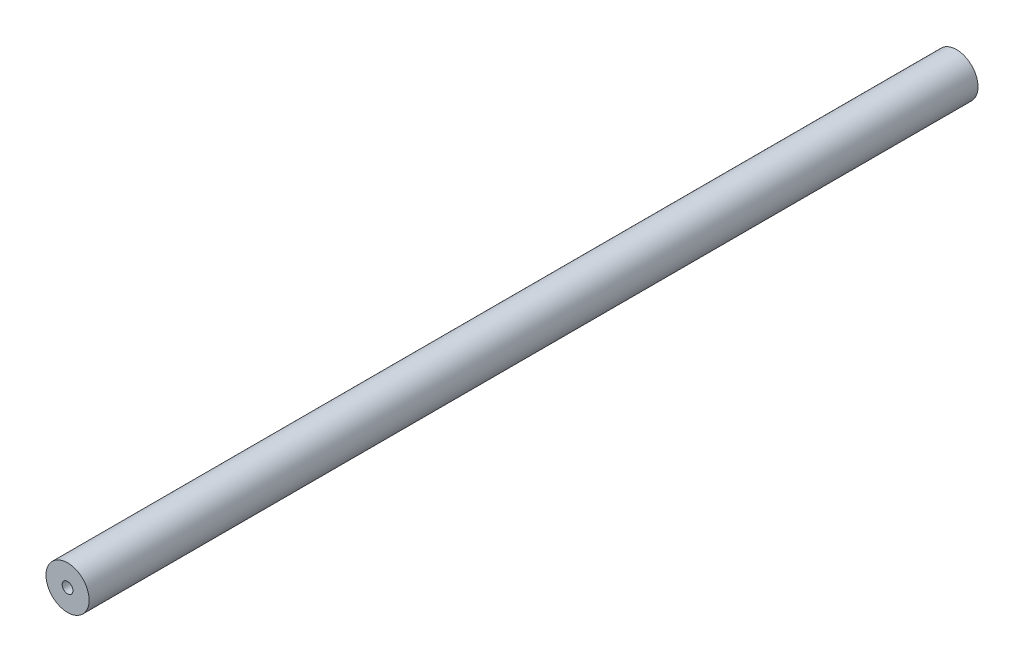
ISO-10303-21;
HEADER;
FILE_DESCRIPTION(('STEP AP214'),'2;1');
FILE_NAME('part.step','',(''),(''),'','','');
FILE_SCHEMA(('AUTOMOTIVE_DESIGN { 1 0 10303 214 1 1 1 1 }'));
ENDSEC;
DATA;
#1=APPLICATION_CONTEXT('core data for automotive mechanical design processes');
#2=APPLICATION_PROTOCOL_DEFINITION('international standard','automotive_design',2000,#1);
#3=PRODUCT_CONTEXT('',#1,'mechanical');
#4=PRODUCT('Part','Part','',(#3));
#5=PRODUCT_RELATED_PRODUCT_CATEGORY('part','',(#4));
#6=PRODUCT_DEFINITION_FORMATION('','',#4);
#7=PRODUCT_DEFINITION_CONTEXT('part definition',#1,'design');
#8=PRODUCT_DEFINITION('design','',#6,#7);
#9=PRODUCT_DEFINITION_SHAPE('','',#8);
#10=(LENGTH_UNIT() NAMED_UNIT(*) SI_UNIT(.MILLI.,.METRE.));
#11=(NAMED_UNIT(*) PLANE_ANGLE_UNIT() SI_UNIT($,.RADIAN.));
#12=(NAMED_UNIT(*) SI_UNIT($,.STERADIAN.) SOLID_ANGLE_UNIT());
#13=UNCERTAINTY_MEASURE_WITH_UNIT(LENGTH_MEASURE(1.E-05),#10,'distance_accuracy_value','');
#14=(GEOMETRIC_REPRESENTATION_CONTEXT(3) GLOBAL_UNCERTAINTY_ASSIGNED_CONTEXT((#13)) GLOBAL_UNIT_ASSIGNED_CONTEXT((#10,
#11,#12)) REPRESENTATION_CONTEXT('',''));
#15=CARTESIAN_POINT('',(0.,0.,0.));
#16=DIRECTION('',(0.,0.,1.));
#17=DIRECTION('',(1.,0.,0.));
#18=AXIS2_PLACEMENT_3D('',#15,#16,#17);
#19=CARTESIAN_POINT('',(0.,0.,330.));
#20=DIRECTION('',(0.,0.,-1.));
#21=DIRECTION('',(-1.,0.,0.));
#22=AXIS2_PLACEMENT_3D('',#19,#20,#21);
#23=CYLINDRICAL_SURFACE('',#22,8.);
#24=CARTESIAN_POINT('',(0.,0.,330.));
#25=DIRECTION('',(0.,0.,1.));
#26=DIRECTION('',(1.,0.,0.));
#27=AXIS2_PLACEMENT_3D('',#24,#25,#26);
#28=CIRCLE('',#27,8.);
#29=CARTESIAN_POINT('',(-8.,0.,330.));
#30=VERTEX_POINT('',#29);
#31=EDGE_CURVE('E10',#30,#30,#28,.T.);
#32=CARTESIAN_POINT('',(0.,0.,0.));
#33=DIRECTION('',(0.,0.,1.));
#34=DIRECTION('',(1.,0.,0.));
#35=AXIS2_PLACEMENT_3D('',#32,#33,#34);
#36=CIRCLE('',#35,8.);
#37=CARTESIAN_POINT('',(-8.,0.,0.));
#38=VERTEX_POINT('',#37);
#39=EDGE_CURVE('E40',#38,#38,#36,.T.);
#40=CARTESIAN_POINT('',(-8.,0.,330.));
#41=CARTESIAN_POINT('',(-8.,0.,326.5625));
#42=CARTESIAN_POINT('',(-8.,0.,323.125));
#43=CARTESIAN_POINT('',(-8.,0.,316.25));
#44=CARTESIAN_POINT('',(-8.,0.,312.8125));
#45=CARTESIAN_POINT('',(-8.,0.,305.9375));
#46=CARTESIAN_POINT('',(-8.,0.,302.5));
#47=CARTESIAN_POINT('',(-8.,0.,295.625));
#48=CARTESIAN_POINT('',(-8.,0.,292.1875));
#49=CARTESIAN_POINT('',(-8.,0.,285.3125));
#50=CARTESIAN_POINT('',(-8.,0.,281.875));
#51=CARTESIAN_POINT('',(-8.,0.,275.));
#52=CARTESIAN_POINT('',(-8.,0.,271.5625));
#53=CARTESIAN_POINT('',(-8.,0.,264.6875));
#54=CARTESIAN_POINT('',(-8.,0.,261.25));
#55=CARTESIAN_POINT('',(-8.,0.,254.375));
#56=CARTESIAN_POINT('',(-8.,0.,250.9375));
#57=CARTESIAN_POINT('',(-8.,0.,244.0625));
#58=CARTESIAN_POINT('',(-8.,0.,240.625));
#59=CARTESIAN_POINT('',(-8.,0.,233.75));
#60=CARTESIAN_POINT('',(-8.,0.,230.3125));
#61=CARTESIAN_POINT('',(-8.,0.,223.4375));
#62=CARTESIAN_POINT('',(-8.,0.,220.));
#63=CARTESIAN_POINT('',(-8.,0.,213.125));
#64=CARTESIAN_POINT('',(-8.,0.,209.6875));
#65=CARTESIAN_POINT('',(-8.,0.,202.8125));
#66=CARTESIAN_POINT('',(-8.,0.,199.375));
#67=CARTESIAN_POINT('',(-8.,0.,192.5));
#68=CARTESIAN_POINT('',(-8.,0.,189.0625));
#69=CARTESIAN_POINT('',(-8.,0.,182.1875));
#70=CARTESIAN_POINT('',(-8.,0.,178.75));
#71=CARTESIAN_POINT('',(-8.,0.,171.875));
#72=CARTESIAN_POINT('',(-8.,0.,168.4375));
#73=CARTESIAN_POINT('',(-8.,0.,161.5625));
#74=CARTESIAN_POINT('',(-8.,0.,158.125));
#75=CARTESIAN_POINT('',(-8.,0.,151.25));
#76=CARTESIAN_POINT('',(-8.,0.,147.8125));
#77=CARTESIAN_POINT('',(-8.,0.,140.9375));
#78=CARTESIAN_POINT('',(-8.,0.,137.5));
#79=CARTESIAN_POINT('',(-8.,0.,130.625));
#80=CARTESIAN_POINT('',(-8.,0.,127.1875));
#81=CARTESIAN_POINT('',(-8.,0.,120.3125));
#82=CARTESIAN_POINT('',(-8.,0.,116.875));
#83=CARTESIAN_POINT('',(-8.,0.,110.));
#84=CARTESIAN_POINT('',(-8.,0.,106.5625));
#85=CARTESIAN_POINT('',(-8.,0.,99.6875));
#86=CARTESIAN_POINT('',(-8.,0.,96.25));
#87=CARTESIAN_POINT('',(-8.,0.,89.375));
#88=CARTESIAN_POINT('',(-8.,0.,85.9375));
#89=CARTESIAN_POINT('',(-8.,0.,79.0625));
#90=CARTESIAN_POINT('',(-8.,0.,75.625));
#91=CARTESIAN_POINT('',(-8.,0.,68.75));
#92=CARTESIAN_POINT('',(-8.,0.,65.3125));
#93=CARTESIAN_POINT('',(-8.,0.,58.4375));
#94=CARTESIAN_POINT('',(-8.,0.,55.));
#95=CARTESIAN_POINT('',(-8.,0.,48.125));
#96=CARTESIAN_POINT('',(-8.,0.,44.6875));
#97=CARTESIAN_POINT('',(-8.,0.,37.8125));
#98=CARTESIAN_POINT('',(-8.,0.,34.375));
#99=CARTESIAN_POINT('',(-8.,0.,27.5));
#100=CARTESIAN_POINT('',(-8.,0.,24.0625));
#101=CARTESIAN_POINT('',(-8.,0.,17.1875));
#102=CARTESIAN_POINT('',(-8.,0.,13.75));
#103=CARTESIAN_POINT('',(-8.,0.,6.875));
#104=CARTESIAN_POINT('',(-8.,0.,3.4375));
#105=CARTESIAN_POINT('',(-8.,0.,0.));
#106=B_SPLINE_CURVE_WITH_KNOTS('',3,(#40,#41,#42,#43,#44,#45,#46,#47,#48,#49,#50,#51,#52,#53,
#54,#55,#56,#57,#58,#59,#60,#61,#62,#63,#64,#65,#66,#67,#68,#69,#70,#71,#72,#73,#74,#75,#76,#77,
#78,#79,#80,#81,#82,#83,#84,#85,#86,#87,#88,#89,#90,#91,#92,#93,#94,#95,#96,#97,#98,#99,#100,
#101,#102,#103,#104,#105),.UNSPECIFIED.,.F.,.F.,(4,2,2,2,2,2,2,2,2,2,2,2,2,2,2,2,2,2,2,2,2,2,2,
2,2,2,2,2,2,2,2,2,4),(0.,10.3125000000001,20.6250000000001,30.9375000000001,41.2500000000001,
51.5625000000001,61.8750000000001,72.1875000000001,82.5000000000001,92.8125000000001,103.125,
113.4375,123.75,134.0625,144.375,154.6875,165.,175.3125,185.625,195.9375,206.25,216.5625,
226.875,237.1875,247.5,257.8125,268.125,278.4375,288.75,299.0625,309.375,319.6875,330.),.UNSPECIFIED.);
#107=EDGE_CURVE('BSEAM37',#30,#38,#106,.T.);
#108=ORIENTED_EDGE('',*,*,#31,.F.);
#109=ORIENTED_EDGE('',*,*,#39,.T.);
#110=ORIENTED_EDGE('',*,*,#107,.T.);
#111=ORIENTED_EDGE('',*,*,#107,.F.);
#112=EDGE_LOOP('',(#108,#110,#109,#111));
#113=FACE_BOUND('',#112,.T.);
#114=ADVANCED_FACE('F37',(#113),#23,.T.);
#115=CARTESIAN_POINT('',(0.,0.,330.));
#116=DIRECTION('',(0.,0.,1.));
#117=DIRECTION('',(1.,0.,0.));
#118=AXIS2_PLACEMENT_3D('',#115,#116,#117);
#119=PLANE('',#118);
#120=CARTESIAN_POINT('',(0.,0.,330.));
#121=DIRECTION('',(0.,0.,1.));
#122=DIRECTION('',(1.,0.,0.));
#123=AXIS2_PLACEMENT_3D('',#120,#121,#122);
#124=CIRCLE('',#123,2.);
#125=CARTESIAN_POINT('',(2.,0.,330.));
#126=VERTEX_POINT('',#125);
#127=EDGE_CURVE('E51',#126,#126,#124,.T.);
#128=ORIENTED_EDGE('',*,*,#127,.F.);
#129=EDGE_LOOP('',(#128));
#130=FACE_BOUND('',#129,.T.);
#131=ORIENTED_EDGE('',*,*,#31,.T.);
#132=EDGE_LOOP('',(#131));
#133=FACE_BOUND('',#132,.T.);
#134=ADVANCED_FACE('F68',(#130,#133),#119,.T.);
#135=CARTESIAN_POINT('',(0.,0.,0.));
#136=DIRECTION('',(0.,0.,1.));
#137=DIRECTION('',(1.,0.,0.));
#138=AXIS2_PLACEMENT_3D('',#135,#136,#137);
#139=PLANE('',#138);
#140=CARTESIAN_POINT('',(0.,0.,0.));
#141=DIRECTION('',(0.,0.,1.));
#142=DIRECTION('',(1.,0.,0.));
#143=AXIS2_PLACEMENT_3D('',#140,#141,#142);
#144=CIRCLE('',#143,2.);
#145=CARTESIAN_POINT('',(2.,0.,0.));
#146=VERTEX_POINT('',#145);
#147=EDGE_CURVE('E49',#146,#146,#144,.T.);
#148=ORIENTED_EDGE('',*,*,#147,.T.);
#149=EDGE_LOOP('',(#148));
#150=FACE_BOUND('',#149,.T.);
#151=ORIENTED_EDGE('',*,*,#39,.F.);
#152=EDGE_LOOP('',(#151));
#153=FACE_BOUND('',#152,.T.);
#154=ADVANCED_FACE('F59',(#150,#153),#139,.F.);
#155=CARTESIAN_POINT('',(0.,0.,0.));
#156=DIRECTION('',(0.,0.,1.));
#157=DIRECTION('',(1.,0.,0.));
#158=AXIS2_PLACEMENT_3D('',#155,#156,#157);
#159=CYLINDRICAL_SURFACE('',#158,2.);
#160=CARTESIAN_POINT('',(2.,0.,0.));
#161=CARTESIAN_POINT('',(2.,0.,3.4375));
#162=CARTESIAN_POINT('',(2.,0.,6.875));
#163=CARTESIAN_POINT('',(2.,0.,13.75));
#164=CARTESIAN_POINT('',(2.,0.,17.1875));
#165=CARTESIAN_POINT('',(2.,0.,24.0625));
#166=CARTESIAN_POINT('',(2.,0.,27.5));
#167=CARTESIAN_POINT('',(2.,0.,34.375));
#168=CARTESIAN_POINT('',(2.,0.,37.8125));
#169=CARTESIAN_POINT('',(2.,0.,44.6875));
#170=CARTESIAN_POINT('',(2.,0.,48.125));
#171=CARTESIAN_POINT('',(2.,0.,55.));
#172=CARTESIAN_POINT('',(2.,0.,58.4375));
#173=CARTESIAN_POINT('',(2.,0.,65.3125));
#174=CARTESIAN_POINT('',(2.,0.,68.75));
#175=CARTESIAN_POINT('',(2.,0.,75.625));
#176=CARTESIAN_POINT('',(2.,0.,79.0625));
#177=CARTESIAN_POINT('',(2.,0.,85.9375));
#178=CARTESIAN_POINT('',(2.,0.,89.375));
#179=CARTESIAN_POINT('',(2.,0.,96.25));
#180=CARTESIAN_POINT('',(2.,0.,99.6875));
#181=CARTESIAN_POINT('',(2.,0.,106.5625));
#182=CARTESIAN_POINT('',(2.,0.,110.));
#183=CARTESIAN_POINT('',(2.,0.,116.875));
#184=CARTESIAN_POINT('',(2.,0.,120.3125));
#185=CARTESIAN_POINT('',(2.,0.,127.1875));
#186=CARTESIAN_POINT('',(2.,0.,130.625));
#187=CARTESIAN_POINT('',(2.,0.,137.5));
#188=CARTESIAN_POINT('',(2.,0.,140.9375));
#189=CARTESIAN_POINT('',(2.,0.,147.8125));
#190=CARTESIAN_POINT('',(2.,0.,151.25));
#191=CARTESIAN_POINT('',(2.,0.,158.125));
#192=CARTESIAN_POINT('',(2.,0.,161.5625));
#193=CARTESIAN_POINT('',(2.,0.,168.4375));
#194=CARTESIAN_POINT('',(2.,0.,171.875));
#195=CARTESIAN_POINT('',(2.,0.,178.75));
#196=CARTESIAN_POINT('',(2.,0.,182.1875));
#197=CARTESIAN_POINT('',(2.,0.,189.0625));
#198=CARTESIAN_POINT('',(2.,0.,192.5));
#199=CARTESIAN_POINT('',(2.,0.,199.375));
#200=CARTESIAN_POINT('',(2.,0.,202.8125));
#201=CARTESIAN_POINT('',(2.,0.,209.6875));
#202=CARTESIAN_POINT('',(2.,0.,213.125));
#203=CARTESIAN_POINT('',(2.,0.,220.));
#204=CARTESIAN_POINT('',(2.,0.,223.4375));
#205=CARTESIAN_POINT('',(2.,0.,230.3125));
#206=CARTESIAN_POINT('',(2.,0.,233.75));
#207=CARTESIAN_POINT('',(2.,0.,240.625));
#208=CARTESIAN_POINT('',(2.,0.,244.0625));
#209=CARTESIAN_POINT('',(2.,0.,250.9375));
#210=CARTESIAN_POINT('',(2.,0.,254.375));
#211=CARTESIAN_POINT('',(2.,0.,261.25));
#212=CARTESIAN_POINT('',(2.,0.,264.6875));
#213=CARTESIAN_POINT('',(2.,0.,271.5625));
#214=CARTESIAN_POINT('',(2.,0.,275.));
#215=CARTESIAN_POINT('',(2.,0.,281.875));
#216=CARTESIAN_POINT('',(2.,0.,285.3125));
#217=CARTESIAN_POINT('',(2.,0.,292.1875));
#218=CARTESIAN_POINT('',(2.,0.,295.625));
#219=CARTESIAN_POINT('',(2.,0.,302.5));
#220=CARTESIAN_POINT('',(2.,0.,305.9375));
#221=CARTESIAN_POINT('',(2.,0.,312.8125));
#222=CARTESIAN_POINT('',(2.,0.,316.25));
#223=CARTESIAN_POINT('',(2.,0.,323.125));
#224=CARTESIAN_POINT('',(2.,0.,326.5625));
#225=CARTESIAN_POINT('',(2.,0.,330.));
#226=B_SPLINE_CURVE_WITH_KNOTS('',3,(#160,#161,#162,#163,#164,#165,#166,#167,#168,#169,#170,
#171,#172,#173,#174,#175,#176,#177,#178,#179,#180,#181,#182,#183,#184,#185,#186,#187,#188,#189,
#190,#191,#192,#193,#194,#195,#196,#197,#198,#199,#200,#201,#202,#203,#204,#205,#206,#207,#208,
#209,#210,#211,#212,#213,#214,#215,#216,#217,#218,#219,#220,#221,#222,#223,#224,#225),
.UNSPECIFIED.,.F.,.F.,(4,2,2,2,2,2,2,2,2,2,2,2,2,2,2,2,2,2,2,2,2,2,2,2,2,2,2,2,2,2,2,2,4),(0.,
10.3125,20.625,30.9375,41.25,51.5625,61.875,72.1875,82.5,92.8125,103.125,113.4375,123.75,
134.0625,144.375,154.6875,165.,175.3125,185.625,195.9375,206.25,216.5625,226.875,237.1875,247.5,
257.8125,268.125,278.4375,288.75,299.0625,309.375,319.6875,330.),.UNSPECIFIED.);
#227=EDGE_CURVE('BSEAM62',#146,#126,#226,.T.);
#228=ORIENTED_EDGE('',*,*,#147,.F.);
#229=ORIENTED_EDGE('',*,*,#127,.T.);
#230=ORIENTED_EDGE('',*,*,#227,.T.);
#231=ORIENTED_EDGE('',*,*,#227,.F.);
#232=EDGE_LOOP('',(#228,#230,#229,#231));
#233=FACE_BOUND('',#232,.T.);
#234=ADVANCED_FACE('F62',(#233),#159,.F.);
#235=CLOSED_SHELL('',(#114,#134,#154,#234));
#236=MANIFOLD_SOLID_BREP('B2',#235);
#237=ADVANCED_BREP_SHAPE_REPRESENTATION('',(#18,#236),#14);
#238=SHAPE_DEFINITION_REPRESENTATION(#9,#237);
ENDSEC;
END-ISO-10303-21;
